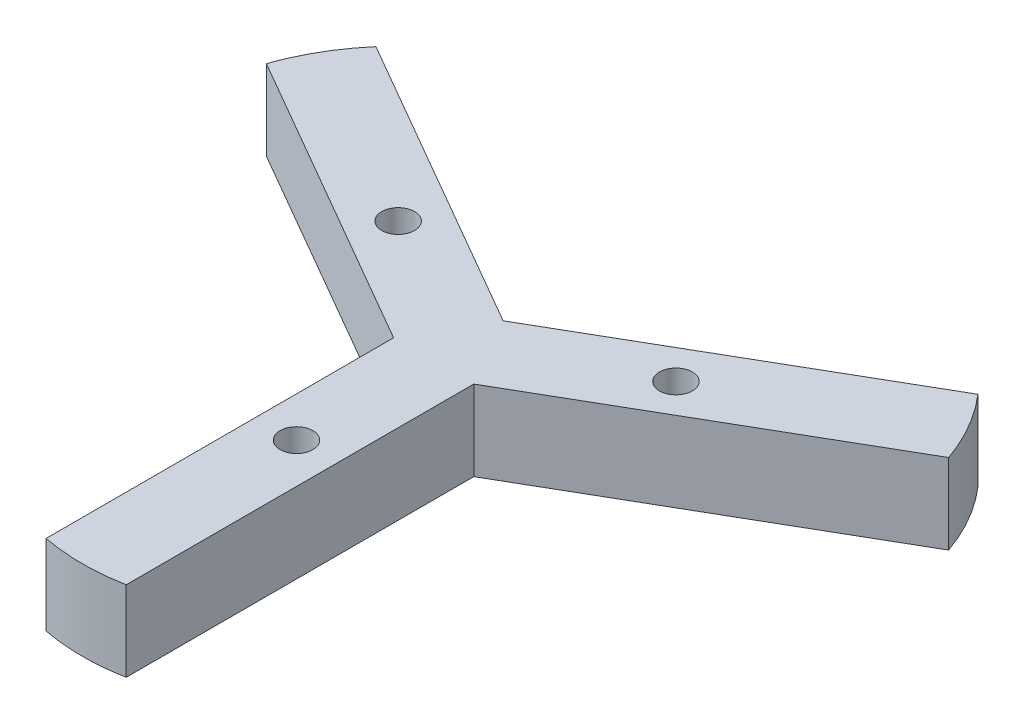
ISO-10303-21;
HEADER;
FILE_DESCRIPTION(('STEP AP214'),'2;1');
FILE_NAME('part.step','',(''),(''),'','','');
FILE_SCHEMA(('AUTOMOTIVE_DESIGN { 1 0 10303 214 1 1 1 1 }'));
ENDSEC;
DATA;
#1=APPLICATION_CONTEXT('core data for automotive mechanical design processes');
#2=APPLICATION_PROTOCOL_DEFINITION('international standard','automotive_design',2000,#1);
#3=PRODUCT_CONTEXT('',#1,'mechanical');
#4=PRODUCT('Part','Part','',(#3));
#5=PRODUCT_RELATED_PRODUCT_CATEGORY('part','',(#4));
#6=PRODUCT_DEFINITION_FORMATION('','',#4);
#7=PRODUCT_DEFINITION_CONTEXT('part definition',#1,'design');
#8=PRODUCT_DEFINITION('design','',#6,#7);
#9=PRODUCT_DEFINITION_SHAPE('','',#8);
#10=(LENGTH_UNIT() NAMED_UNIT(*) SI_UNIT(.MILLI.,.METRE.));
#11=(NAMED_UNIT(*) PLANE_ANGLE_UNIT() SI_UNIT($,.RADIAN.));
#12=(NAMED_UNIT(*) SI_UNIT($,.STERADIAN.) SOLID_ANGLE_UNIT());
#13=UNCERTAINTY_MEASURE_WITH_UNIT(LENGTH_MEASURE(1.E-05),#10,'distance_accuracy_value','');
#14=(GEOMETRIC_REPRESENTATION_CONTEXT(3) GLOBAL_UNCERTAINTY_ASSIGNED_CONTEXT((#13)) GLOBAL_UNIT_ASSIGNED_CONTEXT((#10,
#11,#12)) REPRESENTATION_CONTEXT('',''));
#15=CARTESIAN_POINT('',(0.,0.,0.));
#16=DIRECTION('',(0.,0.,1.));
#17=DIRECTION('',(1.,0.,0.));
#18=AXIS2_PLACEMENT_3D('',#15,#16,#17);
#19=CARTESIAN_POINT('',(21.9970452561248,12.7,-12.7));
#20=DIRECTION('',(0.,1.,0.));
#21=DIRECTION('',(0.,0.,1.));
#22=AXIS2_PLACEMENT_3D('',#19,#20,#21);
#23=PLANE('',#22);
#24=CARTESIAN_POINT('',(-21.9970452561247,12.7,-12.7));
#25=DIRECTION('',(0.,1.,0.));
#26=DIRECTION('',(0.,0.,1.));
#27=AXIS2_PLACEMENT_3D('',#24,#25,#26);
#28=CIRCLE('',#27,2.6035);
#29=CARTESIAN_POINT('',(-21.9970452561247,12.7,-10.0965));
#30=VERTEX_POINT('',#29);
#31=EDGE_CURVE('E204',#30,#30,#28,.T.);
#32=ORIENTED_EDGE('',*,*,#31,.F.);
#33=EDGE_LOOP('',(#32));
#34=FACE_BOUND('',#33,.T.);
#35=DIRECTION('',(0.866025403784443,0.,-0.499999999999992));
#36=VECTOR('',#35,1.);
#37=CARTESIAN_POINT('',(6.35,12.7,3.66617420935416));
#38=LINE('',#37,#36);
#39=CARTESIAN_POINT('',(6.35,12.7,3.66617420935416));
#40=VERTEX_POINT('',#39);
#41=CARTESIAN_POINT('',(54.026964939745,12.7,-23.8601343327514));
#42=VERTEX_POINT('',#41);
#43=EDGE_CURVE('E159',#40,#42,#38,.T.);
#44=ORIENTED_EDGE('',*,*,#43,.T.);
#45=CARTESIAN_POINT('',(21.9970452561248,12.7,-12.7));
#46=DIRECTION('',(0.,1.,0.));
#47=DIRECTION('',(0.,0.,1.));
#48=AXIS2_PLACEMENT_3D('',#45,#46,#47);
#49=CIRCLE('',#48,33.9184957399974);
#50=CARTESIAN_POINT('',(47.6769649397451,12.7,-34.8586569608138));
#51=VERTEX_POINT('',#50);
#52=EDGE_CURVE('E102',#42,#51,#49,.T.);
#53=ORIENTED_EDGE('',*,*,#52,.T.);
#54=DIRECTION('',(-0.866025403784443,0.,0.499999999999992));
#55=VECTOR('',#54,1.);
#56=CARTESIAN_POINT('',(0.,12.7,-7.33234841870824));
#57=LINE('',#56,#55);
#58=CARTESIAN_POINT('',(0.,12.7,-7.33234841870824));
#59=VERTEX_POINT('',#58);
#60=EDGE_CURVE('E177',#51,#59,#57,.T.);
#61=ORIENTED_EDGE('',*,*,#60,.T.);
#62=DIRECTION('',(-0.866025403784436,0.,-0.500000000000004));
#63=VECTOR('',#62,1.);
#64=CARTESIAN_POINT('',(0.,12.7,-7.33234841870824));
#65=LINE('',#64,#63);
#66=CARTESIAN_POINT('',(-47.6769649397446,12.7,-34.8586569608145));
#67=VERTEX_POINT('',#66);
#68=EDGE_CURVE('E194',#59,#67,#65,.T.);
#69=ORIENTED_EDGE('',*,*,#68,.T.);
#70=CARTESIAN_POINT('',(-21.9970452561247,12.7,-12.7));
#71=DIRECTION('',(0.,1.,0.));
#72=DIRECTION('',(0.,0.,1.));
#73=AXIS2_PLACEMENT_3D('',#70,#71,#72);
#74=CIRCLE('',#73,33.9184957399974);
#75=CARTESIAN_POINT('',(-54.0269649397447,12.7,-23.8601343327521));
#76=VERTEX_POINT('',#75);
#77=EDGE_CURVE('E193',#67,#76,#74,.T.);
#78=ORIENTED_EDGE('',*,*,#77,.T.);
#79=DIRECTION('',(0.866025403784436,0.,0.500000000000004));
#80=VECTOR('',#79,1.);
#81=CARTESIAN_POINT('',(-6.35,12.7,3.66617420935411));
#82=LINE('',#81,#80);
#83=CARTESIAN_POINT('',(-6.35,12.7,3.66617420935411));
#84=VERTEX_POINT('',#83);
#85=EDGE_CURVE('E124',#76,#84,#82,.T.);
#86=ORIENTED_EDGE('',*,*,#85,.T.);
#87=DIRECTION('',(0.,0.,1.));
#88=VECTOR('',#87,1.);
#89=CARTESIAN_POINT('',(-6.35,12.7,3.66617420935411));
#90=LINE('',#89,#88);
#91=CARTESIAN_POINT('',(-6.3500000000004,12.7,58.7187912935661));
#92=VERTEX_POINT('',#91);
#93=EDGE_CURVE('E118',#84,#92,#90,.T.);
#94=ORIENTED_EDGE('',*,*,#93,.T.);
#95=CARTESIAN_POINT('',(0.,12.7,25.4));
#96=DIRECTION('',(0.,1.,0.));
#97=DIRECTION('',(0.,0.,1.));
#98=AXIS2_PLACEMENT_3D('',#95,#96,#97);
#99=CIRCLE('',#98,33.9184957399974);
#100=CARTESIAN_POINT('',(6.34999999999959,12.7,58.7187912935662));
#101=VERTEX_POINT('',#100);
#102=EDGE_CURVE('E122',#92,#101,#99,.T.);
#103=ORIENTED_EDGE('',*,*,#102,.T.);
#104=DIRECTION('',(0.,0.,-1.));
#105=VECTOR('',#104,1.);
#106=CARTESIAN_POINT('',(6.35,12.7,3.66617420935416));
#107=LINE('',#106,#105);
#108=EDGE_CURVE('E56',#101,#40,#107,.T.);
#109=ORIENTED_EDGE('',*,*,#108,.T.);
#110=EDGE_LOOP('',(#44,#53,#61,#69,#78,#86,#94,#103,#109));
#111=FACE_BOUND('',#110,.T.);
#112=CARTESIAN_POINT('',(0.,12.7,25.4));
#113=DIRECTION('',(0.,1.,0.));
#114=DIRECTION('',(0.,0.,1.));
#115=AXIS2_PLACEMENT_3D('',#112,#113,#114);
#116=CIRCLE('',#115,2.6035);
#117=CARTESIAN_POINT('',(0.,12.7,28.0035));
#118=VERTEX_POINT('',#117);
#119=EDGE_CURVE('E146',#118,#118,#116,.T.);
#120=ORIENTED_EDGE('',*,*,#119,.F.);
#121=EDGE_LOOP('',(#120));
#122=FACE_BOUND('',#121,.T.);
#123=CARTESIAN_POINT('',(21.9970452561248,12.7,-12.7));
#124=DIRECTION('',(0.,1.,0.));
#125=DIRECTION('',(0.,0.,1.));
#126=AXIS2_PLACEMENT_3D('',#123,#124,#125);
#127=CIRCLE('',#126,2.6035);
#128=CARTESIAN_POINT('',(21.9970452561248,12.7,-10.0965));
#129=VERTEX_POINT('',#128);
#130=EDGE_CURVE('E210',#129,#129,#127,.T.);
#131=ORIENTED_EDGE('',*,*,#130,.F.);
#132=EDGE_LOOP('',(#131));
#133=FACE_BOUND('',#132,.T.);
#134=ADVANCED_FACE('F39',(#34,#111,#122,#133),#23,.T.);
#135=CARTESIAN_POINT('',(21.9970452561248,0.,-12.7));
#136=DIRECTION('',(0.,1.,0.));
#137=DIRECTION('',(0.,0.,1.));
#138=AXIS2_PLACEMENT_3D('',#135,#136,#137);
#139=PLANE('',#138);
#140=DIRECTION('',(0.866025403784443,0.,-0.499999999999992));
#141=VECTOR('',#140,1.);
#142=CARTESIAN_POINT('',(6.35,0.,3.66617420935416));
#143=LINE('',#142,#141);
#144=CARTESIAN_POINT('',(6.35,0.,3.66617420935416));
#145=VERTEX_POINT('',#144);
#146=CARTESIAN_POINT('',(54.026964939745,0.,-23.8601343327514));
#147=VERTEX_POINT('',#146);
#148=EDGE_CURVE('E142',#145,#147,#143,.T.);
#149=ORIENTED_EDGE('',*,*,#148,.F.);
#150=DIRECTION('',(0.,0.,-1.));
#151=VECTOR('',#150,1.);
#152=CARTESIAN_POINT('',(6.35,0.,3.66617420935416));
#153=LINE('',#152,#151);
#154=CARTESIAN_POINT('',(6.34999999999959,0.,58.7187912935662));
#155=VERTEX_POINT('',#154);
#156=EDGE_CURVE('E94',#155,#145,#153,.T.);
#157=ORIENTED_EDGE('',*,*,#156,.F.);
#158=CARTESIAN_POINT('',(0.,0.,25.4));
#159=DIRECTION('',(0.,1.,0.));
#160=DIRECTION('',(0.,0.,1.));
#161=AXIS2_PLACEMENT_3D('',#158,#159,#160);
#162=CIRCLE('',#161,33.9184957399974);
#163=CARTESIAN_POINT('',(-6.3500000000004,0.,58.7187912935661));
#164=VERTEX_POINT('',#163);
#165=EDGE_CURVE('E88',#164,#155,#162,.T.);
#166=ORIENTED_EDGE('',*,*,#165,.F.);
#167=DIRECTION('',(0.,0.,1.));
#168=VECTOR('',#167,1.);
#169=CARTESIAN_POINT('',(-6.35,0.,3.66617420935411));
#170=LINE('',#169,#168);
#171=CARTESIAN_POINT('',(-6.35,0.,3.66617420935411));
#172=VERTEX_POINT('',#171);
#173=EDGE_CURVE('E132',#172,#164,#170,.T.);
#174=ORIENTED_EDGE('',*,*,#173,.F.);
#175=DIRECTION('',(0.866025403784436,0.,0.500000000000004));
#176=VECTOR('',#175,1.);
#177=CARTESIAN_POINT('',(-6.35,0.,3.66617420935411));
#178=LINE('',#177,#176);
#179=CARTESIAN_POINT('',(-54.0269649397447,0.,-23.8601343327521));
#180=VERTEX_POINT('',#179);
#181=EDGE_CURVE('E154',#180,#172,#178,.T.);
#182=ORIENTED_EDGE('',*,*,#181,.F.);
#183=CARTESIAN_POINT('',(-21.9970452561247,0.,-12.7));
#184=DIRECTION('',(0.,1.,0.));
#185=DIRECTION('',(0.,0.,1.));
#186=AXIS2_PLACEMENT_3D('',#183,#184,#185);
#187=CIRCLE('',#186,33.9184957399974);
#188=CARTESIAN_POINT('',(-47.6769649397446,0.,-34.8586569608145));
#189=VERTEX_POINT('',#188);
#190=EDGE_CURVE('E152',#189,#180,#187,.T.);
#191=ORIENTED_EDGE('',*,*,#190,.F.);
#192=DIRECTION('',(-0.866025403784436,0.,-0.500000000000004));
#193=VECTOR('',#192,1.);
#194=CARTESIAN_POINT('',(0.,0.,-7.33234841870824));
#195=LINE('',#194,#193);
#196=CARTESIAN_POINT('',(0.,0.,-7.33234841870824));
#197=VERTEX_POINT('',#196);
#198=EDGE_CURVE('E150',#197,#189,#195,.T.);
#199=ORIENTED_EDGE('',*,*,#198,.F.);
#200=DIRECTION('',(-0.866025403784443,0.,0.499999999999992));
#201=VECTOR('',#200,1.);
#202=CARTESIAN_POINT('',(0.,0.,-7.33234841870824));
#203=LINE('',#202,#201);
#204=CARTESIAN_POINT('',(47.6769649397451,0.,-34.8586569608138));
#205=VERTEX_POINT('',#204);
#206=EDGE_CURVE('E148',#205,#197,#203,.T.);
#207=ORIENTED_EDGE('',*,*,#206,.F.);
#208=CARTESIAN_POINT('',(21.9970452561248,0.,-12.7));
#209=DIRECTION('',(0.,1.,0.));
#210=DIRECTION('',(0.,0.,1.));
#211=AXIS2_PLACEMENT_3D('',#208,#209,#210);
#212=CIRCLE('',#211,33.9184957399974);
#213=EDGE_CURVE('E145',#147,#205,#212,.T.);
#214=ORIENTED_EDGE('',*,*,#213,.F.);
#215=EDGE_LOOP('',(#149,#157,#166,#174,#182,#191,#199,#207,#214));
#216=FACE_BOUND('',#215,.T.);
#217=CARTESIAN_POINT('',(0.,0.,25.4));
#218=DIRECTION('',(0.,1.,0.));
#219=DIRECTION('',(0.,0.,1.));
#220=AXIS2_PLACEMENT_3D('',#217,#218,#219);
#221=CIRCLE('',#220,2.6035);
#222=CARTESIAN_POINT('',(0.,0.,28.0035));
#223=VERTEX_POINT('',#222);
#224=EDGE_CURVE('E201',#223,#223,#221,.T.);
#225=ORIENTED_EDGE('',*,*,#224,.T.);
#226=EDGE_LOOP('',(#225));
#227=FACE_BOUND('',#226,.T.);
#228=CARTESIAN_POINT('',(-21.9970452561247,0.,-12.7));
#229=DIRECTION('',(0.,1.,0.));
#230=DIRECTION('',(0.,0.,1.));
#231=AXIS2_PLACEMENT_3D('',#228,#229,#230);
#232=CIRCLE('',#231,2.6035);
#233=CARTESIAN_POINT('',(-21.9970452561247,0.,-10.0965));
#234=VERTEX_POINT('',#233);
#235=EDGE_CURVE('E207',#234,#234,#232,.T.);
#236=ORIENTED_EDGE('',*,*,#235,.T.);
#237=EDGE_LOOP('',(#236));
#238=FACE_BOUND('',#237,.T.);
#239=CARTESIAN_POINT('',(21.9970452561248,0.,-12.7));
#240=DIRECTION('',(0.,1.,0.));
#241=DIRECTION('',(0.,0.,1.));
#242=AXIS2_PLACEMENT_3D('',#239,#240,#241);
#243=CIRCLE('',#242,2.6035);
#244=CARTESIAN_POINT('',(21.9970452561248,0.,-10.0965));
#245=VERTEX_POINT('',#244);
#246=EDGE_CURVE('E213',#245,#245,#243,.T.);
#247=ORIENTED_EDGE('',*,*,#246,.T.);
#248=EDGE_LOOP('',(#247));
#249=FACE_BOUND('',#248,.T.);
#250=ADVANCED_FACE('F181',(#216,#227,#238,#249),#139,.F.);
#251=CARTESIAN_POINT('',(6.35,12.7,3.66617420935416));
#252=DIRECTION('',(-0.499999999999992,0.,-0.866025403784443));
#253=DIRECTION('',(-0.866025403784443,0.,0.499999999999992));
#254=AXIS2_PLACEMENT_3D('',#251,#252,#253);
#255=PLANE('',#254);
#256=ORIENTED_EDGE('',*,*,#148,.T.);
#257=DIRECTION('',(0.,-1.,0.));
#258=VECTOR('',#257,1.);
#259=CARTESIAN_POINT('',(54.026964939745,12.7,-23.8601343327514));
#260=LINE('',#259,#258);
#261=EDGE_CURVE('E11',#42,#147,#260,.T.);
#262=ORIENTED_EDGE('',*,*,#261,.F.);
#263=ORIENTED_EDGE('',*,*,#43,.F.);
#264=DIRECTION('',(0.,-1.,0.));
#265=VECTOR('',#264,1.);
#266=CARTESIAN_POINT('',(6.35,12.7,3.66617420935416));
#267=LINE('',#266,#265);
#268=EDGE_CURVE('E138',#40,#145,#267,.T.);
#269=ORIENTED_EDGE('',*,*,#268,.T.);
#270=EDGE_LOOP('',(#256,#262,#263,#269));
#271=FACE_BOUND('',#270,.T.);
#272=ADVANCED_FACE('F41',(#271),#255,.F.);
#273=CARTESIAN_POINT('',(21.9970452561248,12.7,-12.7));
#274=DIRECTION('',(0.,-1.,0.));
#275=DIRECTION('',(0.,0.,-1.));
#276=AXIS2_PLACEMENT_3D('',#273,#274,#275);
#277=CYLINDRICAL_SURFACE('',#276,33.9184957399974);
#278=ORIENTED_EDGE('',*,*,#213,.T.);
#279=DIRECTION('',(0.,-1.,0.));
#280=VECTOR('',#279,1.);
#281=CARTESIAN_POINT('',(47.6769649397451,12.7,-34.8586569608138));
#282=LINE('',#281,#280);
#283=EDGE_CURVE('E48',#51,#205,#282,.T.);
#284=ORIENTED_EDGE('',*,*,#283,.F.);
#285=ORIENTED_EDGE('',*,*,#52,.F.);
#286=ORIENTED_EDGE('',*,*,#261,.T.);
#287=EDGE_LOOP('',(#278,#284,#285,#286));
#288=FACE_BOUND('',#287,.T.);
#289=ADVANCED_FACE('F250',(#288),#277,.T.);
#290=CARTESIAN_POINT('',(0.,12.7,-7.33234841870824));
#291=DIRECTION('',(0.499999999999992,0.,0.866025403784443));
#292=DIRECTION('',(0.866025403784443,0.,-0.499999999999992));
#293=AXIS2_PLACEMENT_3D('',#290,#291,#292);
#294=PLANE('',#293);
#295=ORIENTED_EDGE('',*,*,#206,.T.);
#296=DIRECTION('',(0.,-1.,0.));
#297=VECTOR('',#296,1.);
#298=CARTESIAN_POINT('',(0.,12.7,-7.33234841870824));
#299=LINE('',#298,#297);
#300=EDGE_CURVE('E169',#59,#197,#299,.T.);
#301=ORIENTED_EDGE('',*,*,#300,.F.);
#302=ORIENTED_EDGE('',*,*,#60,.F.);
#303=ORIENTED_EDGE('',*,*,#283,.T.);
#304=EDGE_LOOP('',(#295,#301,#302,#303));
#305=FACE_BOUND('',#304,.T.);
#306=ADVANCED_FACE('F175',(#305),#294,.F.);
#307=CARTESIAN_POINT('',(0.,12.7,-7.33234841870824));
#308=DIRECTION('',(-0.500000000000004,0.,0.866025403784436));
#309=DIRECTION('',(0.866025403784436,0.,0.500000000000004));
#310=AXIS2_PLACEMENT_3D('',#307,#308,#309);
#311=PLANE('',#310);
#312=ORIENTED_EDGE('',*,*,#198,.T.);
#313=DIRECTION('',(0.,-1.,0.));
#314=VECTOR('',#313,1.);
#315=CARTESIAN_POINT('',(-47.6769649397446,12.7,-34.8586569608145));
#316=LINE('',#315,#314);
#317=EDGE_CURVE('E166',#67,#189,#316,.T.);
#318=ORIENTED_EDGE('',*,*,#317,.F.);
#319=ORIENTED_EDGE('',*,*,#68,.F.);
#320=ORIENTED_EDGE('',*,*,#300,.T.);
#321=EDGE_LOOP('',(#312,#318,#319,#320));
#322=FACE_BOUND('',#321,.T.);
#323=ADVANCED_FACE('F187',(#322),#311,.F.);
#324=CARTESIAN_POINT('',(-21.9970452561247,12.7,-12.7));
#325=DIRECTION('',(0.,-1.,0.));
#326=DIRECTION('',(0.,0.,-1.));
#327=AXIS2_PLACEMENT_3D('',#324,#325,#326);
#328=CYLINDRICAL_SURFACE('',#327,33.9184957399974);
#329=ORIENTED_EDGE('',*,*,#190,.T.);
#330=DIRECTION('',(0.,-1.,0.));
#331=VECTOR('',#330,1.);
#332=CARTESIAN_POINT('',(-54.0269649397447,12.7,-23.8601343327521));
#333=LINE('',#332,#331);
#334=EDGE_CURVE('E163',#76,#180,#333,.T.);
#335=ORIENTED_EDGE('',*,*,#334,.F.);
#336=ORIENTED_EDGE('',*,*,#77,.F.);
#337=ORIENTED_EDGE('',*,*,#317,.T.);
#338=EDGE_LOOP('',(#329,#335,#336,#337));
#339=FACE_BOUND('',#338,.T.);
#340=ADVANCED_FACE('F191',(#339),#328,.T.);
#341=CARTESIAN_POINT('',(-6.35,12.7,3.66617420935411));
#342=DIRECTION('',(0.500000000000004,0.,-0.866025403784436));
#343=DIRECTION('',(-0.866025403784436,0.,-0.500000000000004));
#344=AXIS2_PLACEMENT_3D('',#341,#342,#343);
#345=PLANE('',#344);
#346=ORIENTED_EDGE('',*,*,#181,.T.);
#347=DIRECTION('',(0.,-1.,0.));
#348=VECTOR('',#347,1.);
#349=CARTESIAN_POINT('',(-6.35,12.7,3.66617420935411));
#350=LINE('',#349,#348);
#351=EDGE_CURVE('E133',#84,#172,#350,.T.);
#352=ORIENTED_EDGE('',*,*,#351,.F.);
#353=ORIENTED_EDGE('',*,*,#85,.F.);
#354=ORIENTED_EDGE('',*,*,#334,.T.);
#355=EDGE_LOOP('',(#346,#352,#353,#354));
#356=FACE_BOUND('',#355,.T.);
#357=ADVANCED_FACE('F241',(#356),#345,.F.);
#358=CARTESIAN_POINT('',(-6.35,12.7,3.66617420935411));
#359=DIRECTION('',(1.,0.,0.));
#360=DIRECTION('',(0.,0.,-1.));
#361=AXIS2_PLACEMENT_3D('',#358,#359,#360);
#362=PLANE('',#361);
#363=ORIENTED_EDGE('',*,*,#173,.T.);
#364=DIRECTION('',(0.,-1.,0.));
#365=VECTOR('',#364,1.);
#366=CARTESIAN_POINT('',(-6.3500000000004,12.7,58.7187912935661));
#367=LINE('',#366,#365);
#368=EDGE_CURVE('E129',#92,#164,#367,.T.);
#369=ORIENTED_EDGE('',*,*,#368,.F.);
#370=ORIENTED_EDGE('',*,*,#93,.F.);
#371=ORIENTED_EDGE('',*,*,#351,.T.);
#372=EDGE_LOOP('',(#363,#369,#370,#371));
#373=FACE_BOUND('',#372,.T.);
#374=ADVANCED_FACE('F130',(#373),#362,.F.);
#375=CARTESIAN_POINT('',(0.,12.7,25.4));
#376=DIRECTION('',(0.,-1.,0.));
#377=DIRECTION('',(0.,0.,-1.));
#378=AXIS2_PLACEMENT_3D('',#375,#376,#377);
#379=CYLINDRICAL_SURFACE('',#378,33.9184957399974);
#380=ORIENTED_EDGE('',*,*,#165,.T.);
#381=DIRECTION('',(0.,-1.,0.));
#382=VECTOR('',#381,1.);
#383=CARTESIAN_POINT('',(6.34999999999959,12.7,58.7187912935662));
#384=LINE('',#383,#382);
#385=EDGE_CURVE('E134',#101,#155,#384,.T.);
#386=ORIENTED_EDGE('',*,*,#385,.F.);
#387=ORIENTED_EDGE('',*,*,#102,.F.);
#388=ORIENTED_EDGE('',*,*,#368,.T.);
#389=EDGE_LOOP('',(#380,#386,#387,#388));
#390=FACE_BOUND('',#389,.T.);
#391=ADVANCED_FACE('F136',(#390),#379,.T.);
#392=CARTESIAN_POINT('',(6.35,12.7,3.66617420935416));
#393=DIRECTION('',(-1.,0.,0.));
#394=DIRECTION('',(0.,0.,1.));
#395=AXIS2_PLACEMENT_3D('',#392,#393,#394);
#396=PLANE('',#395);
#397=ORIENTED_EDGE('',*,*,#156,.T.);
#398=ORIENTED_EDGE('',*,*,#268,.F.);
#399=ORIENTED_EDGE('',*,*,#108,.F.);
#400=ORIENTED_EDGE('',*,*,#385,.T.);
#401=EDGE_LOOP('',(#397,#398,#399,#400));
#402=FACE_BOUND('',#401,.T.);
#403=ADVANCED_FACE('F234',(#402),#396,.F.);
#404=CARTESIAN_POINT('',(0.,12.7,25.4));
#405=DIRECTION('',(0.,-1.,0.));
#406=DIRECTION('',(0.,0.,-1.));
#407=AXIS2_PLACEMENT_3D('',#404,#405,#406);
#408=CYLINDRICAL_SURFACE('',#407,2.6035);
#409=ORIENTED_EDGE('',*,*,#119,.T.);
#410=EDGE_LOOP('',(#409));
#411=FACE_BOUND('',#410,.T.);
#412=ORIENTED_EDGE('',*,*,#224,.F.);
#413=EDGE_LOOP('',(#412));
#414=FACE_BOUND('',#413,.T.);
#415=ADVANCED_FACE('F231',(#411,#414),#408,.F.);
#416=CARTESIAN_POINT('',(-21.9970452561247,12.7,-12.7));
#417=DIRECTION('',(0.,-1.,0.));
#418=DIRECTION('',(0.,0.,-1.));
#419=AXIS2_PLACEMENT_3D('',#416,#417,#418);
#420=CYLINDRICAL_SURFACE('',#419,2.6035);
#421=ORIENTED_EDGE('',*,*,#31,.T.);
#422=EDGE_LOOP('',(#421));
#423=FACE_BOUND('',#422,.T.);
#424=ORIENTED_EDGE('',*,*,#235,.F.);
#425=EDGE_LOOP('',(#424));
#426=FACE_BOUND('',#425,.T.);
#427=ADVANCED_FACE('F319',(#423,#426),#420,.F.);
#428=CARTESIAN_POINT('',(21.9970452561248,12.7,-12.7));
#429=DIRECTION('',(0.,-1.,0.));
#430=DIRECTION('',(0.,0.,-1.));
#431=AXIS2_PLACEMENT_3D('',#428,#429,#430);
#432=CYLINDRICAL_SURFACE('',#431,2.6035);
#433=ORIENTED_EDGE('',*,*,#130,.T.);
#434=EDGE_LOOP('',(#433));
#435=FACE_BOUND('',#434,.T.);
#436=ORIENTED_EDGE('',*,*,#246,.F.);
#437=EDGE_LOOP('',(#436));
#438=FACE_BOUND('',#437,.T.);
#439=ADVANCED_FACE('F219',(#435,#438),#432,.F.);
#440=CLOSED_SHELL('',(#134,#250,#272,#289,#306,#323,#340,#357,#374,#391,#403,#415,#427,#439));
#441=MANIFOLD_SOLID_BREP('B2',#440);
#442=ADVANCED_BREP_SHAPE_REPRESENTATION('',(#18,#441),#14);
#443=SHAPE_DEFINITION_REPRESENTATION(#9,#442);
ENDSEC;
END-ISO-10303-21;
